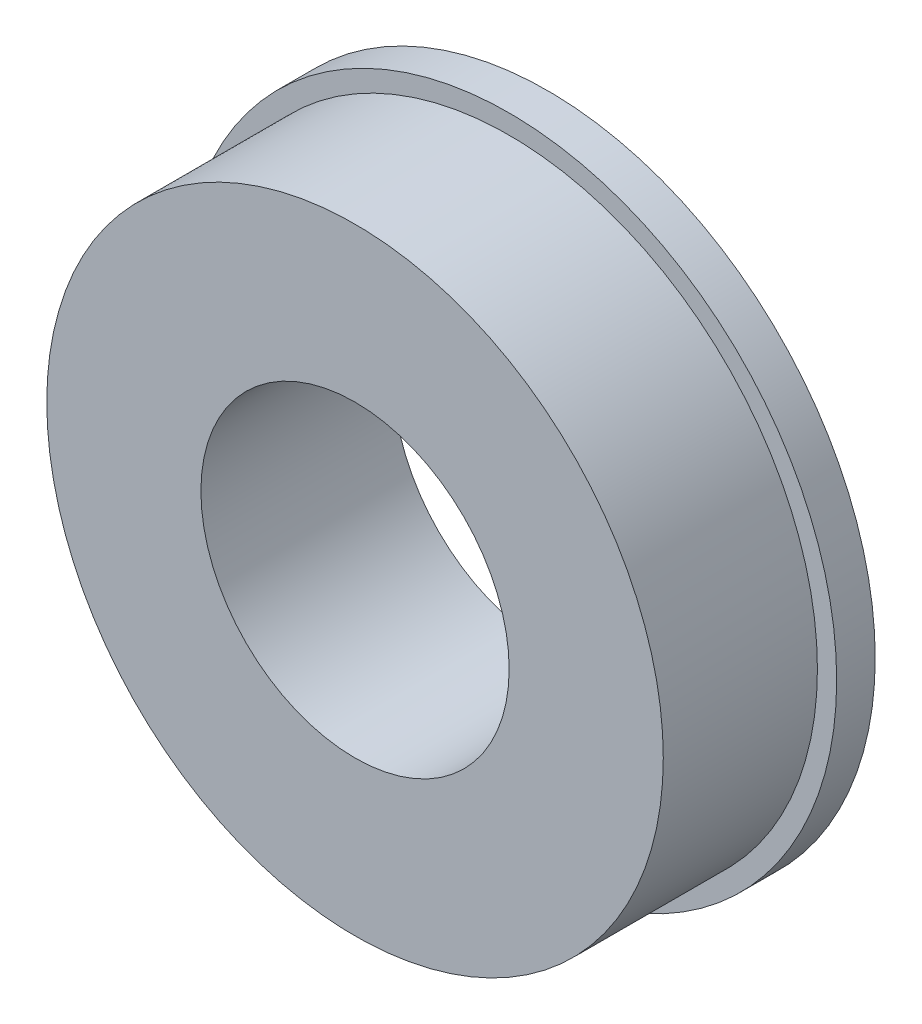
ISO-10303-21;
HEADER;
FILE_DESCRIPTION(('STEP AP214'),'2;1');
FILE_NAME('part.step','',(''),(''),'','','');
FILE_SCHEMA(('AUTOMOTIVE_DESIGN { 1 0 10303 214 1 1 1 1 }'));
ENDSEC;
DATA;
#1=APPLICATION_CONTEXT('core data for automotive mechanical design processes');
#2=APPLICATION_PROTOCOL_DEFINITION('international standard','automotive_design',2000,#1);
#3=PRODUCT_CONTEXT('',#1,'mechanical');
#4=PRODUCT('Part','Part','',(#3));
#5=PRODUCT_RELATED_PRODUCT_CATEGORY('part','',(#4));
#6=PRODUCT_DEFINITION_FORMATION('','',#4);
#7=PRODUCT_DEFINITION_CONTEXT('part definition',#1,'design');
#8=PRODUCT_DEFINITION('design','',#6,#7);
#9=PRODUCT_DEFINITION_SHAPE('','',#8);
#10=(LENGTH_UNIT() NAMED_UNIT(*) SI_UNIT(.MILLI.,.METRE.));
#11=(NAMED_UNIT(*) PLANE_ANGLE_UNIT() SI_UNIT($,.RADIAN.));
#12=(NAMED_UNIT(*) SI_UNIT($,.STERADIAN.) SOLID_ANGLE_UNIT());
#13=UNCERTAINTY_MEASURE_WITH_UNIT(LENGTH_MEASURE(1.E-05),#10,'distance_accuracy_value','');
#14=(GEOMETRIC_REPRESENTATION_CONTEXT(3) GLOBAL_UNCERTAINTY_ASSIGNED_CONTEXT((#13)) GLOBAL_UNIT_ASSIGNED_CONTEXT((#10,
#11,#12)) REPRESENTATION_CONTEXT('',''));
#15=CARTESIAN_POINT('',(0.,0.,0.));
#16=DIRECTION('',(0.,0.,1.));
#17=DIRECTION('',(1.,0.,0.));
#18=AXIS2_PLACEMENT_3D('',#15,#16,#17);
#19=CARTESIAN_POINT('',(0.,0.,1.));
#20=DIRECTION('',(0.,0.,-1.));
#21=DIRECTION('',(-1.,0.,0.));
#22=AXIS2_PLACEMENT_3D('',#19,#20,#21);
#23=CYLINDRICAL_SURFACE('',#22,8.5);
#24=CARTESIAN_POINT('',(0.,0.,1.));
#25=DIRECTION('',(0.,0.,1.));
#26=DIRECTION('',(1.,0.,0.));
#27=AXIS2_PLACEMENT_3D('',#24,#25,#26);
#28=CIRCLE('',#27,8.5);
#29=CARTESIAN_POINT('',(8.5,0.,1.));
#30=VERTEX_POINT('',#29);
#31=EDGE_CURVE('E39',#30,#30,#28,.T.);
#32=ORIENTED_EDGE('',*,*,#31,.F.);
#33=EDGE_LOOP('',(#32));
#34=FACE_BOUND('',#33,.T.);
#35=CARTESIAN_POINT('',(0.,0.,0.));
#36=DIRECTION('',(0.,0.,1.));
#37=DIRECTION('',(1.,0.,0.));
#38=AXIS2_PLACEMENT_3D('',#35,#36,#37);
#39=CIRCLE('',#38,8.5);
#40=CARTESIAN_POINT('',(8.5,0.,0.));
#41=VERTEX_POINT('',#40);
#42=EDGE_CURVE('E35',#41,#41,#39,.T.);
#43=ORIENTED_EDGE('',*,*,#42,.T.);
#44=EDGE_LOOP('',(#43));
#45=FACE_BOUND('',#44,.T.);
#46=ADVANCED_FACE('F32',(#34,#45),#23,.T.);
#47=CARTESIAN_POINT('',(0.,0.,1.));
#48=DIRECTION('',(0.,0.,1.));
#49=DIRECTION('',(1.,0.,0.));
#50=AXIS2_PLACEMENT_3D('',#47,#48,#49);
#51=PLANE('',#50);
#52=CARTESIAN_POINT('',(0.,0.,1.));
#53=DIRECTION('',(0.,0.,1.));
#54=DIRECTION('',(1.,0.,0.));
#55=AXIS2_PLACEMENT_3D('',#52,#53,#54);
#56=CIRCLE('',#55,8.);
#57=CARTESIAN_POINT('',(8.,0.,1.));
#58=VERTEX_POINT('',#57);
#59=EDGE_CURVE('E10',#58,#58,#56,.T.);
#60=ORIENTED_EDGE('',*,*,#59,.F.);
#61=EDGE_LOOP('',(#60));
#62=FACE_BOUND('',#61,.T.);
#63=ORIENTED_EDGE('',*,*,#31,.T.);
#64=EDGE_LOOP('',(#63));
#65=FACE_BOUND('',#64,.T.);
#66=ADVANCED_FACE('F70',(#62,#65),#51,.T.);
#67=CARTESIAN_POINT('',(0.,0.,0.));
#68=DIRECTION('',(0.,0.,1.));
#69=DIRECTION('',(1.,0.,0.));
#70=AXIS2_PLACEMENT_3D('',#67,#68,#69);
#71=PLANE('',#70);
#72=CARTESIAN_POINT('',(0.,0.,0.));
#73=DIRECTION('',(0.,0.,1.));
#74=DIRECTION('',(1.,0.,0.));
#75=AXIS2_PLACEMENT_3D('',#72,#73,#74);
#76=CIRCLE('',#75,4.);
#77=CARTESIAN_POINT('',(4.,0.,0.));
#78=VERTEX_POINT('',#77);
#79=EDGE_CURVE('E48',#78,#78,#76,.F.);
#80=ORIENTED_EDGE('',*,*,#79,.F.);
#81=EDGE_LOOP('',(#80));
#82=FACE_BOUND('',#81,.T.);
#83=ORIENTED_EDGE('',*,*,#42,.F.);
#84=EDGE_LOOP('',(#83));
#85=FACE_BOUND('',#84,.T.);
#86=ADVANCED_FACE('F65',(#82,#85),#71,.F.);
#87=CARTESIAN_POINT('',(0.,0.,5.));
#88=DIRECTION('',(0.,0.,-1.));
#89=DIRECTION('',(-1.,0.,0.));
#90=AXIS2_PLACEMENT_3D('',#87,#88,#89);
#91=CYLINDRICAL_SURFACE('',#90,8.);
#92=CARTESIAN_POINT('',(0.,0.,5.));
#93=DIRECTION('',(0.,0.,1.));
#94=DIRECTION('',(1.,0.,0.));
#95=AXIS2_PLACEMENT_3D('',#92,#93,#94);
#96=CIRCLE('',#95,8.);
#97=CARTESIAN_POINT('',(8.,0.,5.));
#98=VERTEX_POINT('',#97);
#99=EDGE_CURVE('E45',#98,#98,#96,.T.);
#100=ORIENTED_EDGE('',*,*,#99,.F.);
#101=EDGE_LOOP('',(#100));
#102=FACE_BOUND('',#101,.T.);
#103=ORIENTED_EDGE('',*,*,#59,.T.);
#104=EDGE_LOOP('',(#103));
#105=FACE_BOUND('',#104,.T.);
#106=ADVANCED_FACE('F60',(#102,#105),#91,.T.);
#107=CARTESIAN_POINT('',(0.,0.,5.));
#108=DIRECTION('',(0.,0.,1.));
#109=DIRECTION('',(1.,0.,0.));
#110=AXIS2_PLACEMENT_3D('',#107,#108,#109);
#111=PLANE('',#110);
#112=CARTESIAN_POINT('',(0.,0.,5.));
#113=DIRECTION('',(0.,0.,1.));
#114=DIRECTION('',(1.,0.,0.));
#115=AXIS2_PLACEMENT_3D('',#112,#113,#114);
#116=CIRCLE('',#115,4.);
#117=CARTESIAN_POINT('',(4.,0.,5.));
#118=VERTEX_POINT('',#117);
#119=EDGE_CURVE('E51',#118,#118,#116,.T.);
#120=ORIENTED_EDGE('',*,*,#119,.F.);
#121=EDGE_LOOP('',(#120));
#122=FACE_BOUND('',#121,.T.);
#123=ORIENTED_EDGE('',*,*,#99,.T.);
#124=EDGE_LOOP('',(#123));
#125=FACE_BOUND('',#124,.T.);
#126=ADVANCED_FACE('F57',(#122,#125),#111,.T.);
#127=CARTESIAN_POINT('',(0.,0.,-11.3137084989848));
#128=DIRECTION('',(0.,0.,1.));
#129=DIRECTION('',(1.,0.,0.));
#130=AXIS2_PLACEMENT_3D('',#127,#128,#129);
#131=CYLINDRICAL_SURFACE('',#130,4.);
#132=ORIENTED_EDGE('',*,*,#79,.T.);
#133=EDGE_LOOP('',(#132));
#134=FACE_BOUND('',#133,.T.);
#135=ORIENTED_EDGE('',*,*,#119,.T.);
#136=EDGE_LOOP('',(#135));
#137=FACE_BOUND('',#136,.T.);
#138=ADVANCED_FACE('F55',(#134,#137),#131,.F.);
#139=CLOSED_SHELL('',(#46,#66,#86,#106,#126,#138));
#140=MANIFOLD_SOLID_BREP('B2',#139);
#141=ADVANCED_BREP_SHAPE_REPRESENTATION('',(#18,#140),#14);
#142=SHAPE_DEFINITION_REPRESENTATION(#9,#141);
ENDSEC;
END-ISO-10303-21;
